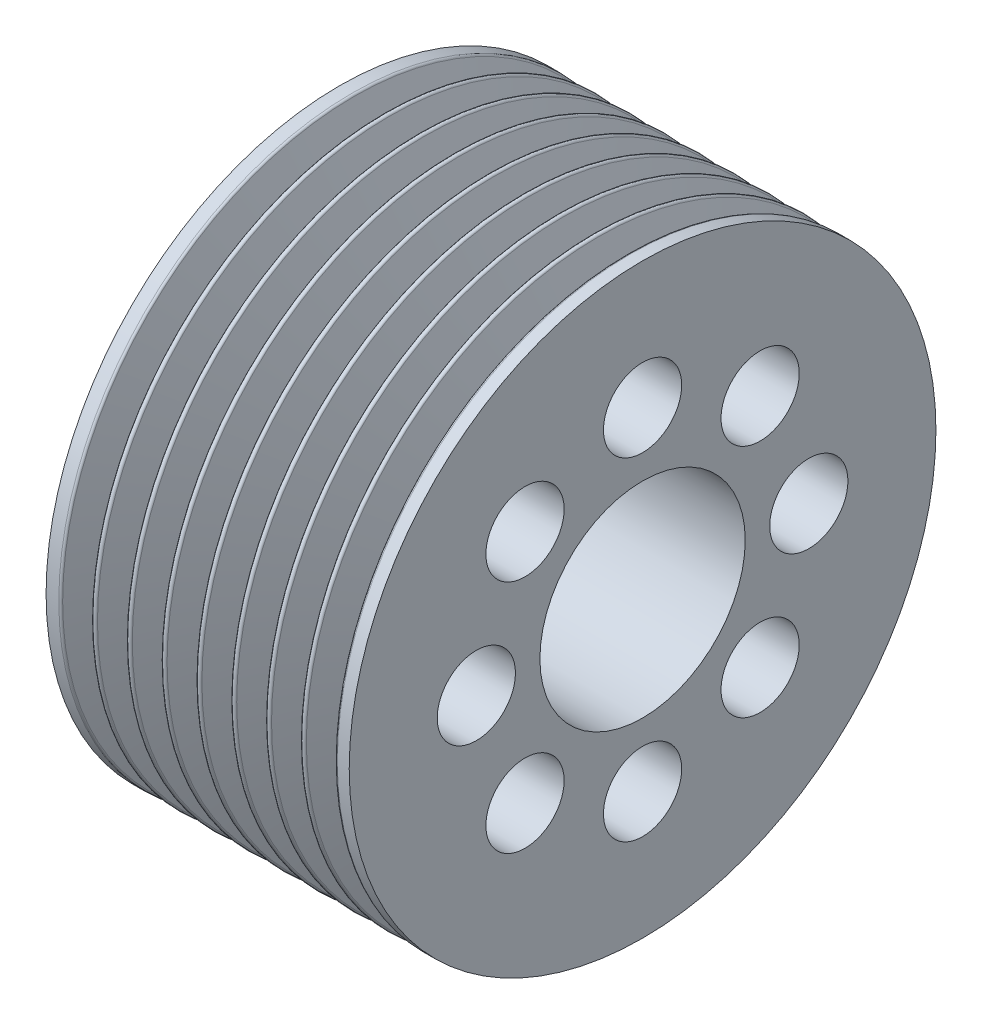
ISO-10303-21;
HEADER;
FILE_DESCRIPTION(('STEP AP214'),'2;1');
FILE_NAME('part.step','',(''),(''),'','','');
FILE_SCHEMA(('AUTOMOTIVE_DESIGN { 1 0 10303 214 1 1 1 1 }'));
ENDSEC;
DATA;
#1=APPLICATION_CONTEXT('core data for automotive mechanical design processes');
#2=APPLICATION_PROTOCOL_DEFINITION('international standard','automotive_design',2000,#1);
#3=PRODUCT_CONTEXT('',#1,'mechanical');
#4=PRODUCT('Part','Part','',(#3));
#5=PRODUCT_RELATED_PRODUCT_CATEGORY('part','',(#4));
#6=PRODUCT_DEFINITION_FORMATION('','',#4);
#7=PRODUCT_DEFINITION_CONTEXT('part definition',#1,'design');
#8=PRODUCT_DEFINITION('design','',#6,#7);
#9=PRODUCT_DEFINITION_SHAPE('','',#8);
#10=(LENGTH_UNIT() NAMED_UNIT(*) SI_UNIT(.MILLI.,.METRE.));
#11=(NAMED_UNIT(*) PLANE_ANGLE_UNIT() SI_UNIT($,.RADIAN.));
#12=(NAMED_UNIT(*) SI_UNIT($,.STERADIAN.) SOLID_ANGLE_UNIT());
#13=UNCERTAINTY_MEASURE_WITH_UNIT(LENGTH_MEASURE(1.E-05),#10,'distance_accuracy_value','');
#14=(GEOMETRIC_REPRESENTATION_CONTEXT(3) GLOBAL_UNCERTAINTY_ASSIGNED_CONTEXT((#13)) GLOBAL_UNIT_ASSIGNED_CONTEXT((#10,
#11,#12)) REPRESENTATION_CONTEXT('',''));
#15=CARTESIAN_POINT('',(0.,0.,0.));
#16=DIRECTION('',(0.,0.,1.));
#17=DIRECTION('',(1.,0.,0.));
#18=AXIS2_PLACEMENT_3D('',#15,#16,#17);
#19=CARTESIAN_POINT('',(0.,0.,0.));
#20=DIRECTION('',(-1.,0.,0.));
#21=DIRECTION('',(0.,0.,1.));
#22=AXIS2_PLACEMENT_3D('',#19,#20,#21);
#23=CYLINDRICAL_SURFACE('',#22,30.);
#24=CARTESIAN_POINT('',(18.,0.,0.));
#25=DIRECTION('',(-1.,0.,0.));
#26=DIRECTION('',(0.,0.,1.));
#27=AXIS2_PLACEMENT_3D('',#24,#25,#26);
#28=CIRCLE('',#27,30.);
#29=CARTESIAN_POINT('',(18.,0.,30.));
#30=VERTEX_POINT('',#29);
#31=EDGE_CURVE('E54',#30,#30,#28,.T.);
#32=ORIENTED_EDGE('',*,*,#31,.F.);
#33=EDGE_LOOP('',(#32));
#34=FACE_BOUND('',#33,.T.);
#35=CARTESIAN_POINT('',(19.3,0.,0.));
#36=DIRECTION('',(-1.,0.,0.));
#37=DIRECTION('',(0.,0.,1.));
#38=AXIS2_PLACEMENT_3D('',#35,#36,#37);
#39=CIRCLE('',#38,30.);
#40=CARTESIAN_POINT('',(19.3,0.,30.));
#41=VERTEX_POINT('',#40);
#42=EDGE_CURVE('E168',#41,#41,#39,.T.);
#43=ORIENTED_EDGE('',*,*,#42,.T.);
#44=EDGE_LOOP('',(#43));
#45=FACE_BOUND('',#44,.T.);
#46=ADVANCED_FACE('F42',(#34,#45),#23,.T.);
#47=CARTESIAN_POINT('',(31.5,10.5,0.));
#48=DIRECTION('',(1.,0.,0.));
#49=DIRECTION('',(0.,0.,-1.));
#50=AXIS2_PLACEMENT_3D('',#47,#48,#49);
#51=PLANE('',#50);
#52=CARTESIAN_POINT('',(31.5,12.0208152801713,12.0208152801713));
#53=DIRECTION('',(1.,0.,0.));
#54=DIRECTION('',(0.,0.,-1.));
#55=AXIS2_PLACEMENT_3D('',#52,#53,#54);
#56=CIRCLE('',#55,4.);
#57=CARTESIAN_POINT('',(31.5,12.0208152801713,8.02081528017131));
#58=VERTEX_POINT('',#57);
#59=EDGE_CURVE('E213',#58,#58,#56,.F.);
#60=ORIENTED_EDGE('',*,*,#59,.F.);
#61=EDGE_LOOP('',(#60));
#62=FACE_BOUND('',#61,.T.);
#63=CARTESIAN_POINT('',(31.5,-12.0208152801713,12.0208152801713));
#64=DIRECTION('',(1.,0.,0.));
#65=DIRECTION('',(0.,0.,-1.));
#66=AXIS2_PLACEMENT_3D('',#63,#64,#65);
#67=CIRCLE('',#66,4.);
#68=CARTESIAN_POINT('',(31.5,-12.0208152801713,8.02081528017133));
#69=VERTEX_POINT('',#68);
#70=EDGE_CURVE('E207',#69,#69,#67,.F.);
#71=ORIENTED_EDGE('',*,*,#70,.F.);
#72=EDGE_LOOP('',(#71));
#73=FACE_BOUND('',#72,.T.);
#74=CARTESIAN_POINT('',(31.5,-17.,-2.47198095326695E-13));
#75=DIRECTION('',(1.,0.,0.));
#76=DIRECTION('',(0.,0.,-1.));
#77=AXIS2_PLACEMENT_3D('',#74,#75,#76);
#78=CIRCLE('',#77,4.);
#79=CARTESIAN_POINT('',(31.5,-17.,-4.00000000000025));
#80=VERTEX_POINT('',#79);
#81=EDGE_CURVE('E201',#80,#80,#78,.F.);
#82=ORIENTED_EDGE('',*,*,#81,.F.);
#83=EDGE_LOOP('',(#82));
#84=FACE_BOUND('',#83,.T.);
#85=CARTESIAN_POINT('',(31.5,-12.020815280171,-12.0208152801716));
#86=DIRECTION('',(1.,0.,0.));
#87=DIRECTION('',(0.,0.,-1.));
#88=AXIS2_PLACEMENT_3D('',#85,#86,#87);
#89=CIRCLE('',#88,4.);
#90=CARTESIAN_POINT('',(31.5,-12.020815280171,-16.0208152801716));
#91=VERTEX_POINT('',#90);
#92=EDGE_CURVE('E195',#91,#91,#89,.F.);
#93=ORIENTED_EDGE('',*,*,#92,.F.);
#94=EDGE_LOOP('',(#93));
#95=FACE_BOUND('',#94,.T.);
#96=CARTESIAN_POINT('',(31.5,0.,-17.));
#97=DIRECTION('',(1.,0.,0.));
#98=DIRECTION('',(0.,0.,-1.));
#99=AXIS2_PLACEMENT_3D('',#96,#97,#98);
#100=CIRCLE('',#99,4.);
#101=CARTESIAN_POINT('',(31.5,0.,-21.));
#102=VERTEX_POINT('',#101);
#103=EDGE_CURVE('E189',#102,#102,#100,.F.);
#104=ORIENTED_EDGE('',*,*,#103,.F.);
#105=EDGE_LOOP('',(#104));
#106=FACE_BOUND('',#105,.T.);
#107=CARTESIAN_POINT('',(31.5,12.0208152801713,-12.0208152801713));
#108=DIRECTION('',(1.,0.,0.));
#109=DIRECTION('',(0.,0.,-1.));
#110=AXIS2_PLACEMENT_3D('',#107,#108,#109);
#111=CIRCLE('',#110,4.);
#112=CARTESIAN_POINT('',(31.5,12.0208152801713,-16.0208152801713));
#113=VERTEX_POINT('',#112);
#114=EDGE_CURVE('E183',#113,#113,#111,.F.);
#115=ORIENTED_EDGE('',*,*,#114,.F.);
#116=EDGE_LOOP('',(#115));
#117=FACE_BOUND('',#116,.T.);
#118=CARTESIAN_POINT('',(31.5,1.72382073893029E-13,17.));
#119=DIRECTION('',(1.,0.,0.));
#120=DIRECTION('',(0.,0.,-1.));
#121=AXIS2_PLACEMENT_3D('',#118,#119,#120);
#122=CIRCLE('',#121,4.);
#123=CARTESIAN_POINT('',(31.5,1.72382073893029E-13,13.));
#124=VERTEX_POINT('',#123);
#125=EDGE_CURVE('E177',#124,#124,#122,.F.);
#126=ORIENTED_EDGE('',*,*,#125,.F.);
#127=EDGE_LOOP('',(#126));
#128=FACE_BOUND('',#127,.T.);
#129=CARTESIAN_POINT('',(31.5,17.,0.));
#130=DIRECTION('',(1.,0.,0.));
#131=DIRECTION('',(0.,0.,-1.));
#132=AXIS2_PLACEMENT_3D('',#129,#130,#131);
#133=CIRCLE('',#132,4.);
#134=CARTESIAN_POINT('',(31.5,17.,-4.));
#135=VERTEX_POINT('',#134);
#136=EDGE_CURVE('E171',#135,#135,#133,.F.);
#137=ORIENTED_EDGE('',*,*,#136,.F.);
#138=EDGE_LOOP('',(#137));
#139=FACE_BOUND('',#138,.T.);
#140=CARTESIAN_POINT('',(31.5,0.,0.));
#141=DIRECTION('',(-1.,0.,0.));
#142=DIRECTION('',(0.,0.,1.));
#143=AXIS2_PLACEMENT_3D('',#140,#141,#142);
#144=CIRCLE('',#143,10.5);
#145=CARTESIAN_POINT('',(31.5,0.,10.5));
#146=VERTEX_POINT('',#145);
#147=EDGE_CURVE('E66',#146,#146,#144,.T.);
#148=ORIENTED_EDGE('',*,*,#147,.F.);
#149=EDGE_LOOP('',(#148));
#150=FACE_BOUND('',#149,.T.);
#151=CARTESIAN_POINT('',(31.5,0.,0.));
#152=DIRECTION('',(-1.,0.,0.));
#153=DIRECTION('',(0.,0.,1.));
#154=AXIS2_PLACEMENT_3D('',#151,#152,#153);
#155=CIRCLE('',#154,21.5);
#156=CARTESIAN_POINT('',(31.5,0.,21.5));
#157=VERTEX_POINT('',#156);
#158=EDGE_CURVE('E10',#157,#157,#155,.T.);
#159=ORIENTED_EDGE('',*,*,#158,.T.);
#160=EDGE_LOOP('',(#159));
#161=FACE_BOUND('',#160,.T.);
#162=ADVANCED_FACE('F45',(#62,#73,#84,#95,#106,#117,#128,#139,#150,#161),#51,.F.);
#163=CARTESIAN_POINT('',(0.,0.,0.));
#164=DIRECTION('',(-1.,0.,0.));
#165=DIRECTION('',(0.,0.,1.));
#166=AXIS2_PLACEMENT_3D('',#163,#164,#165);
#167=CYLINDRICAL_SURFACE('',#166,21.5);
#168=ORIENTED_EDGE('',*,*,#158,.F.);
#169=EDGE_LOOP('',(#168));
#170=FACE_BOUND('',#169,.T.);
#171=CARTESIAN_POINT('',(18.,0.,0.));
#172=DIRECTION('',(-1.,0.,0.));
#173=DIRECTION('',(0.,0.,1.));
#174=AXIS2_PLACEMENT_3D('',#171,#172,#173);
#175=CIRCLE('',#174,21.5);
#176=CARTESIAN_POINT('',(18.,0.,21.5));
#177=VERTEX_POINT('',#176);
#178=EDGE_CURVE('E50',#177,#177,#175,.T.);
#179=ORIENTED_EDGE('',*,*,#178,.T.);
#180=EDGE_LOOP('',(#179));
#181=FACE_BOUND('',#180,.T.);
#182=ADVANCED_FACE('F253',(#170,#181),#167,.F.);
#183=CARTESIAN_POINT('',(18.,30.,0.));
#184=DIRECTION('',(1.,0.,0.));
#185=DIRECTION('',(0.,0.,-1.));
#186=AXIS2_PLACEMENT_3D('',#183,#184,#185);
#187=PLANE('',#186);
#188=ORIENTED_EDGE('',*,*,#178,.F.);
#189=EDGE_LOOP('',(#188));
#190=FACE_BOUND('',#189,.T.);
#191=ORIENTED_EDGE('',*,*,#31,.T.);
#192=EDGE_LOOP('',(#191));
#193=FACE_BOUND('',#192,.T.);
#194=ADVANCED_FACE('F259',(#190,#193),#187,.F.);
#195=CARTESIAN_POINT('',(47.78,0.,0.));
#196=DIRECTION('',(-1.,0.,0.));
#197=DIRECTION('',(0.,0.,1.));
#198=AXIS2_PLACEMENT_3D('',#195,#196,#197);
#199=CIRCLE('',#198,30.);
#200=CARTESIAN_POINT('',(47.78,0.,30.));
#201=VERTEX_POINT('',#200);
#202=EDGE_CURVE('E81',#201,#201,#199,.T.);
#203=ORIENTED_EDGE('',*,*,#202,.F.);
#204=EDGE_LOOP('',(#203));
#205=FACE_BOUND('',#204,.T.);
#206=CARTESIAN_POINT('',(49.,0.,0.));
#207=DIRECTION('',(-1.,0.,0.));
#208=DIRECTION('',(0.,0.,1.));
#209=AXIS2_PLACEMENT_3D('',#206,#207,#208);
#210=CIRCLE('',#209,30.);
#211=CARTESIAN_POINT('',(49.,0.,30.));
#212=VERTEX_POINT('',#211);
#213=EDGE_CURVE('E58',#212,#212,#210,.T.);
#214=ORIENTED_EDGE('',*,*,#213,.T.);
#215=EDGE_LOOP('',(#214));
#216=FACE_BOUND('',#215,.T.);
#217=ADVANCED_FACE('F226',(#205,#216),#23,.T.);
#218=CARTESIAN_POINT('',(49.,10.5,0.));
#219=DIRECTION('',(-1.,0.,0.));
#220=DIRECTION('',(0.,0.,1.));
#221=AXIS2_PLACEMENT_3D('',#218,#219,#220);
#222=PLANE('',#221);
#223=CARTESIAN_POINT('',(49.,12.0208152801713,12.0208152801713));
#224=DIRECTION('',(1.,0.,0.));
#225=DIRECTION('',(0.,0.,-1.));
#226=AXIS2_PLACEMENT_3D('',#223,#224,#225);
#227=CIRCLE('',#226,4.);
#228=CARTESIAN_POINT('',(49.,12.0208152801713,8.02081528017131));
#229=VERTEX_POINT('',#228);
#230=EDGE_CURVE('E216',#229,#229,#227,.T.);
#231=ORIENTED_EDGE('',*,*,#230,.F.);
#232=EDGE_LOOP('',(#231));
#233=FACE_BOUND('',#232,.T.);
#234=CARTESIAN_POINT('',(49.,-12.0208152801713,12.0208152801713));
#235=DIRECTION('',(1.,0.,0.));
#236=DIRECTION('',(0.,0.,-1.));
#237=AXIS2_PLACEMENT_3D('',#234,#235,#236);
#238=CIRCLE('',#237,4.);
#239=CARTESIAN_POINT('',(49.,-12.0208152801713,8.02081528017133));
#240=VERTEX_POINT('',#239);
#241=EDGE_CURVE('E210',#240,#240,#238,.T.);
#242=ORIENTED_EDGE('',*,*,#241,.F.);
#243=EDGE_LOOP('',(#242));
#244=FACE_BOUND('',#243,.T.);
#245=CARTESIAN_POINT('',(49.,-17.,-2.47198095326695E-13));
#246=DIRECTION('',(1.,0.,0.));
#247=DIRECTION('',(0.,0.,-1.));
#248=AXIS2_PLACEMENT_3D('',#245,#246,#247);
#249=CIRCLE('',#248,4.);
#250=CARTESIAN_POINT('',(49.,-17.,-4.00000000000025));
#251=VERTEX_POINT('',#250);
#252=EDGE_CURVE('E204',#251,#251,#249,.T.);
#253=ORIENTED_EDGE('',*,*,#252,.F.);
#254=EDGE_LOOP('',(#253));
#255=FACE_BOUND('',#254,.T.);
#256=CARTESIAN_POINT('',(49.,-12.020815280171,-12.0208152801716));
#257=DIRECTION('',(1.,0.,0.));
#258=DIRECTION('',(0.,0.,-1.));
#259=AXIS2_PLACEMENT_3D('',#256,#257,#258);
#260=CIRCLE('',#259,4.);
#261=CARTESIAN_POINT('',(49.,-12.020815280171,-16.0208152801716));
#262=VERTEX_POINT('',#261);
#263=EDGE_CURVE('E198',#262,#262,#260,.T.);
#264=ORIENTED_EDGE('',*,*,#263,.F.);
#265=EDGE_LOOP('',(#264));
#266=FACE_BOUND('',#265,.T.);
#267=CARTESIAN_POINT('',(49.,0.,-17.));
#268=DIRECTION('',(1.,0.,0.));
#269=DIRECTION('',(0.,0.,-1.));
#270=AXIS2_PLACEMENT_3D('',#267,#268,#269);
#271=CIRCLE('',#270,4.);
#272=CARTESIAN_POINT('',(49.,0.,-21.));
#273=VERTEX_POINT('',#272);
#274=EDGE_CURVE('E192',#273,#273,#271,.T.);
#275=ORIENTED_EDGE('',*,*,#274,.F.);
#276=EDGE_LOOP('',(#275));
#277=FACE_BOUND('',#276,.T.);
#278=CARTESIAN_POINT('',(49.,12.0208152801713,-12.0208152801713));
#279=DIRECTION('',(1.,0.,0.));
#280=DIRECTION('',(0.,0.,-1.));
#281=AXIS2_PLACEMENT_3D('',#278,#279,#280);
#282=CIRCLE('',#281,4.);
#283=CARTESIAN_POINT('',(49.,12.0208152801713,-16.0208152801713));
#284=VERTEX_POINT('',#283);
#285=EDGE_CURVE('E186',#284,#284,#282,.T.);
#286=ORIENTED_EDGE('',*,*,#285,.F.);
#287=EDGE_LOOP('',(#286));
#288=FACE_BOUND('',#287,.T.);
#289=CARTESIAN_POINT('',(49.,1.72382073893029E-13,17.));
#290=DIRECTION('',(1.,0.,0.));
#291=DIRECTION('',(0.,0.,-1.));
#292=AXIS2_PLACEMENT_3D('',#289,#290,#291);
#293=CIRCLE('',#292,4.);
#294=CARTESIAN_POINT('',(49.,1.72382073893029E-13,13.));
#295=VERTEX_POINT('',#294);
#296=EDGE_CURVE('E180',#295,#295,#293,.T.);
#297=ORIENTED_EDGE('',*,*,#296,.F.);
#298=EDGE_LOOP('',(#297));
#299=FACE_BOUND('',#298,.T.);
#300=CARTESIAN_POINT('',(49.,17.,0.));
#301=DIRECTION('',(1.,0.,0.));
#302=DIRECTION('',(0.,0.,-1.));
#303=AXIS2_PLACEMENT_3D('',#300,#301,#302);
#304=CIRCLE('',#303,4.);
#305=CARTESIAN_POINT('',(49.,17.,-4.));
#306=VERTEX_POINT('',#305);
#307=EDGE_CURVE('E174',#306,#306,#304,.T.);
#308=ORIENTED_EDGE('',*,*,#307,.F.);
#309=EDGE_LOOP('',(#308));
#310=FACE_BOUND('',#309,.T.);
#311=ORIENTED_EDGE('',*,*,#213,.F.);
#312=EDGE_LOOP('',(#311));
#313=FACE_BOUND('',#312,.T.);
#314=CARTESIAN_POINT('',(49.,0.,0.));
#315=DIRECTION('',(-1.,0.,0.));
#316=DIRECTION('',(0.,0.,1.));
#317=AXIS2_PLACEMENT_3D('',#314,#315,#316);
#318=CIRCLE('',#317,10.5);
#319=CARTESIAN_POINT('',(49.,0.,10.5));
#320=VERTEX_POINT('',#319);
#321=EDGE_CURVE('E63',#320,#320,#318,.T.);
#322=ORIENTED_EDGE('',*,*,#321,.T.);
#323=EDGE_LOOP('',(#322));
#324=FACE_BOUND('',#323,.T.);
#325=ADVANCED_FACE('F222',(#233,#244,#255,#266,#277,#288,#299,#310,#313,#324),#222,.F.);
#326=CARTESIAN_POINT('',(0.,0.,0.));
#327=DIRECTION('',(-1.,0.,0.));
#328=DIRECTION('',(0.,0.,1.));
#329=AXIS2_PLACEMENT_3D('',#326,#327,#328);
#330=CYLINDRICAL_SURFACE('',#329,10.5);
#331=ORIENTED_EDGE('',*,*,#321,.F.);
#332=EDGE_LOOP('',(#331));
#333=FACE_BOUND('',#332,.T.);
#334=ORIENTED_EDGE('',*,*,#147,.T.);
#335=EDGE_LOOP('',(#334));
#336=FACE_BOUND('',#335,.T.);
#337=ADVANCED_FACE('F225',(#333,#336),#330,.F.);
#338=CARTESIAN_POINT('',(47.78,0.,0.));
#339=DIRECTION('',(-1.,0.,0.));
#340=DIRECTION('',(0.,0.,1.));
#341=AXIS2_PLACEMENT_3D('',#338,#339,#340);
#342=TOROIDAL_SURFACE('',#341,29.75,0.249999999999997);
#343=ORIENTED_EDGE('',*,*,#202,.T.);
#344=EDGE_LOOP('',(#343));
#345=FACE_BOUND('',#344,.T.);
#346=CARTESIAN_POINT('',(47.5458319526879,0.,0.));
#347=DIRECTION('',(-1.,0.,0.));
#348=DIRECTION('',(0.,0.,1.));
#349=AXIS2_PLACEMENT_3D('',#346,#347,#348);
#350=CIRCLE('',#349,29.8375518453149);
#351=CARTESIAN_POINT('',(47.5458319526879,0.,29.8375518453149));
#352=VERTEX_POINT('',#351);
#353=EDGE_CURVE('E69',#352,#352,#350,.T.);
#354=ORIENTED_EDGE('',*,*,#353,.F.);
#355=EDGE_LOOP('',(#354));
#356=FACE_BOUND('',#355,.T.);
#357=ADVANCED_FACE('F248',(#345,#356),#342,.T.);
#358=CARTESIAN_POINT('',(46.2810016567745,0.,0.));
#359=DIRECTION('',(1.,0.,0.));
#360=DIRECTION('',(0.,0.,-1.));
#361=AXIS2_PLACEMENT_3D('',#358,#359,#360);
#362=CONICAL_SURFACE('',#361,26.4546095496951,1.21300383013606);
#363=ORIENTED_EDGE('',*,*,#353,.T.);
#364=EDGE_LOOP('',(#363));
#365=FACE_BOUND('',#364,.T.);
#366=CARTESIAN_POINT('',(46.2810016567745,0.,0.));
#367=DIRECTION('',(-1.,0.,0.));
#368=DIRECTION('',(0.,0.,1.));
#369=AXIS2_PLACEMENT_3D('',#366,#367,#368);
#370=CIRCLE('',#369,26.4546095496951);
#371=CARTESIAN_POINT('',(46.2810016567745,0.,26.4546095496951));
#372=VERTEX_POINT('',#371);
#373=EDGE_CURVE('E72',#372,#372,#370,.T.);
#374=ORIENTED_EDGE('',*,*,#373,.F.);
#375=EDGE_LOOP('',(#374));
#376=FACE_BOUND('',#375,.T.);
#377=ADVANCED_FACE('F449',(#365,#376),#362,.T.);
#378=CARTESIAN_POINT('',(46.,0.,0.));
#379=DIRECTION('',(-1.,0.,0.));
#380=DIRECTION('',(0.,0.,1.));
#381=AXIS2_PLACEMENT_3D('',#378,#379,#380);
#382=TOROIDAL_SURFACE('',#381,26.5596717640729,0.300000000000001);
#383=ORIENTED_EDGE('',*,*,#373,.T.);
#384=EDGE_LOOP('',(#383));
#385=FACE_BOUND('',#384,.T.);
#386=CARTESIAN_POINT('',(45.7189983432255,0.,0.));
#387=DIRECTION('',(-1.,0.,0.));
#388=DIRECTION('',(0.,0.,1.));
#389=AXIS2_PLACEMENT_3D('',#386,#387,#388);
#390=CIRCLE('',#389,26.4546095496951);
#391=CARTESIAN_POINT('',(45.7189983432255,0.,26.4546095496951));
#392=VERTEX_POINT('',#391);
#393=EDGE_CURVE('E75',#392,#392,#390,.T.);
#394=ORIENTED_EDGE('',*,*,#393,.F.);
#395=EDGE_LOOP('',(#394));
#396=FACE_BOUND('',#395,.T.);
#397=ADVANCED_FACE('F444',(#385,#396),#382,.F.);
#398=CARTESIAN_POINT('',(44.4541680473121,0.,0.));
#399=DIRECTION('',(-1.,0.,0.));
#400=DIRECTION('',(0.,0.,1.));
#401=AXIS2_PLACEMENT_3D('',#398,#399,#400);
#402=CONICAL_SURFACE('',#401,29.8375518453149,1.21300383013606);
#403=ORIENTED_EDGE('',*,*,#393,.T.);
#404=EDGE_LOOP('',(#403));
#405=FACE_BOUND('',#404,.T.);
#406=CARTESIAN_POINT('',(44.4541680473121,0.,0.));
#407=DIRECTION('',(-1.,0.,0.));
#408=DIRECTION('',(0.,0.,1.));
#409=AXIS2_PLACEMENT_3D('',#406,#407,#408);
#410=CIRCLE('',#409,29.8375518453149);
#411=CARTESIAN_POINT('',(44.4541680473121,0.,29.8375518453149));
#412=VERTEX_POINT('',#411);
#413=EDGE_CURVE('E78',#412,#412,#410,.T.);
#414=ORIENTED_EDGE('',*,*,#413,.F.);
#415=EDGE_LOOP('',(#414));
#416=FACE_BOUND('',#415,.T.);
#417=ADVANCED_FACE('F439',(#405,#416),#402,.T.);
#418=CARTESIAN_POINT('',(44.22,0.,0.));
#419=DIRECTION('',(-1.,0.,0.));
#420=DIRECTION('',(0.,0.,1.));
#421=AXIS2_PLACEMENT_3D('',#418,#419,#420);
#422=TOROIDAL_SURFACE('',#421,29.75,0.250000000000004);
#423=ORIENTED_EDGE('',*,*,#413,.T.);
#424=EDGE_LOOP('',(#423));
#425=FACE_BOUND('',#424,.T.);
#426=CARTESIAN_POINT('',(43.9858319526879,0.,0.));
#427=DIRECTION('',(-1.,0.,0.));
#428=DIRECTION('',(0.,0.,1.));
#429=AXIS2_PLACEMENT_3D('',#426,#427,#428);
#430=CIRCLE('',#429,29.8375518453149);
#431=CARTESIAN_POINT('',(43.9858319526879,0.,29.8375518453149));
#432=VERTEX_POINT('',#431);
#433=EDGE_CURVE('E84',#432,#432,#430,.T.);
#434=ORIENTED_EDGE('',*,*,#433,.F.);
#435=EDGE_LOOP('',(#434));
#436=FACE_BOUND('',#435,.T.);
#437=ADVANCED_FACE('F434',(#425,#436),#422,.T.);
#438=CARTESIAN_POINT('',(42.7210016567745,0.,0.));
#439=DIRECTION('',(1.,0.,0.));
#440=DIRECTION('',(0.,0.,-1.));
#441=AXIS2_PLACEMENT_3D('',#438,#439,#440);
#442=CONICAL_SURFACE('',#441,26.4546095496951,1.21300383013606);
#443=ORIENTED_EDGE('',*,*,#433,.T.);
#444=EDGE_LOOP('',(#443));
#445=FACE_BOUND('',#444,.T.);
#446=CARTESIAN_POINT('',(42.7210016567745,0.,0.));
#447=DIRECTION('',(-1.,0.,0.));
#448=DIRECTION('',(0.,0.,1.));
#449=AXIS2_PLACEMENT_3D('',#446,#447,#448);
#450=CIRCLE('',#449,26.4546095496951);
#451=CARTESIAN_POINT('',(42.7210016567745,0.,26.4546095496951));
#452=VERTEX_POINT('',#451);
#453=EDGE_CURVE('E87',#452,#452,#450,.T.);
#454=ORIENTED_EDGE('',*,*,#453,.F.);
#455=EDGE_LOOP('',(#454));
#456=FACE_BOUND('',#455,.T.);
#457=ADVANCED_FACE('F429',(#445,#456),#442,.T.);
#458=CARTESIAN_POINT('',(42.44,0.,0.));
#459=DIRECTION('',(-1.,0.,0.));
#460=DIRECTION('',(0.,0.,1.));
#461=AXIS2_PLACEMENT_3D('',#458,#459,#460);
#462=TOROIDAL_SURFACE('',#461,26.5596717640729,0.300000000000001);
#463=ORIENTED_EDGE('',*,*,#453,.T.);
#464=EDGE_LOOP('',(#463));
#465=FACE_BOUND('',#464,.T.);
#466=CARTESIAN_POINT('',(42.1589983432255,0.,0.));
#467=DIRECTION('',(-1.,0.,0.));
#468=DIRECTION('',(0.,0.,1.));
#469=AXIS2_PLACEMENT_3D('',#466,#467,#468);
#470=CIRCLE('',#469,26.4546095496951);
#471=CARTESIAN_POINT('',(42.1589983432255,0.,26.4546095496951));
#472=VERTEX_POINT('',#471);
#473=EDGE_CURVE('E90',#472,#472,#470,.T.);
#474=ORIENTED_EDGE('',*,*,#473,.F.);
#475=EDGE_LOOP('',(#474));
#476=FACE_BOUND('',#475,.T.);
#477=ADVANCED_FACE('F424',(#465,#476),#462,.F.);
#478=CARTESIAN_POINT('',(40.8941680473121,0.,0.));
#479=DIRECTION('',(-1.,0.,0.));
#480=DIRECTION('',(0.,0.,1.));
#481=AXIS2_PLACEMENT_3D('',#478,#479,#480);
#482=CONICAL_SURFACE('',#481,29.8375518453149,1.21300383013606);
#483=ORIENTED_EDGE('',*,*,#473,.T.);
#484=EDGE_LOOP('',(#483));
#485=FACE_BOUND('',#484,.T.);
#486=CARTESIAN_POINT('',(40.8941680473121,0.,0.));
#487=DIRECTION('',(-1.,0.,0.));
#488=DIRECTION('',(0.,0.,1.));
#489=AXIS2_PLACEMENT_3D('',#486,#487,#488);
#490=CIRCLE('',#489,29.8375518453149);
#491=CARTESIAN_POINT('',(40.8941680473121,0.,29.8375518453149));
#492=VERTEX_POINT('',#491);
#493=EDGE_CURVE('E93',#492,#492,#490,.T.);
#494=ORIENTED_EDGE('',*,*,#493,.F.);
#495=EDGE_LOOP('',(#494));
#496=FACE_BOUND('',#495,.T.);
#497=ADVANCED_FACE('F419',(#485,#496),#482,.T.);
#498=CARTESIAN_POINT('',(40.66,0.,0.));
#499=DIRECTION('',(-1.,0.,0.));
#500=DIRECTION('',(0.,0.,1.));
#501=AXIS2_PLACEMENT_3D('',#498,#499,#500);
#502=TOROIDAL_SURFACE('',#501,29.75,0.250000000000004);
#503=ORIENTED_EDGE('',*,*,#493,.T.);
#504=EDGE_LOOP('',(#503));
#505=FACE_BOUND('',#504,.T.);
#506=CARTESIAN_POINT('',(40.4258319526879,0.,0.));
#507=DIRECTION('',(-1.,0.,0.));
#508=DIRECTION('',(0.,0.,1.));
#509=AXIS2_PLACEMENT_3D('',#506,#507,#508);
#510=CIRCLE('',#509,29.8375518453149);
#511=CARTESIAN_POINT('',(40.4258319526879,0.,29.8375518453149));
#512=VERTEX_POINT('',#511);
#513=EDGE_CURVE('E96',#512,#512,#510,.T.);
#514=ORIENTED_EDGE('',*,*,#513,.F.);
#515=EDGE_LOOP('',(#514));
#516=FACE_BOUND('',#515,.T.);
#517=ADVANCED_FACE('F414',(#505,#516),#502,.T.);
#518=CARTESIAN_POINT('',(39.1610016567745,0.,0.));
#519=DIRECTION('',(1.,0.,0.));
#520=DIRECTION('',(0.,0.,-1.));
#521=AXIS2_PLACEMENT_3D('',#518,#519,#520);
#522=CONICAL_SURFACE('',#521,26.4546095496951,1.21300383013606);
#523=ORIENTED_EDGE('',*,*,#513,.T.);
#524=EDGE_LOOP('',(#523));
#525=FACE_BOUND('',#524,.T.);
#526=CARTESIAN_POINT('',(39.1610016567745,0.,0.));
#527=DIRECTION('',(-1.,0.,0.));
#528=DIRECTION('',(0.,0.,1.));
#529=AXIS2_PLACEMENT_3D('',#526,#527,#528);
#530=CIRCLE('',#529,26.4546095496951);
#531=CARTESIAN_POINT('',(39.1610016567745,0.,26.4546095496951));
#532=VERTEX_POINT('',#531);
#533=EDGE_CURVE('E99',#532,#532,#530,.T.);
#534=ORIENTED_EDGE('',*,*,#533,.F.);
#535=EDGE_LOOP('',(#534));
#536=FACE_BOUND('',#535,.T.);
#537=ADVANCED_FACE('F409',(#525,#536),#522,.T.);
#538=CARTESIAN_POINT('',(38.88,0.,0.));
#539=DIRECTION('',(-1.,0.,0.));
#540=DIRECTION('',(0.,0.,1.));
#541=AXIS2_PLACEMENT_3D('',#538,#539,#540);
#542=TOROIDAL_SURFACE('',#541,26.5596717640729,0.300000000000001);
#543=ORIENTED_EDGE('',*,*,#533,.T.);
#544=EDGE_LOOP('',(#543));
#545=FACE_BOUND('',#544,.T.);
#546=CARTESIAN_POINT('',(38.5989983432255,0.,0.));
#547=DIRECTION('',(-1.,0.,0.));
#548=DIRECTION('',(0.,0.,1.));
#549=AXIS2_PLACEMENT_3D('',#546,#547,#548);
#550=CIRCLE('',#549,26.4546095496951);
#551=CARTESIAN_POINT('',(38.5989983432255,0.,26.4546095496951));
#552=VERTEX_POINT('',#551);
#553=EDGE_CURVE('E102',#552,#552,#550,.T.);
#554=ORIENTED_EDGE('',*,*,#553,.F.);
#555=EDGE_LOOP('',(#554));
#556=FACE_BOUND('',#555,.T.);
#557=ADVANCED_FACE('F404',(#545,#556),#542,.F.);
#558=CARTESIAN_POINT('',(37.3341680473121,0.,0.));
#559=DIRECTION('',(-1.,0.,0.));
#560=DIRECTION('',(0.,0.,1.));
#561=AXIS2_PLACEMENT_3D('',#558,#559,#560);
#562=CONICAL_SURFACE('',#561,29.8375518453149,1.21300383013606);
#563=ORIENTED_EDGE('',*,*,#553,.T.);
#564=EDGE_LOOP('',(#563));
#565=FACE_BOUND('',#564,.T.);
#566=CARTESIAN_POINT('',(37.3341680473121,0.,0.));
#567=DIRECTION('',(-1.,0.,0.));
#568=DIRECTION('',(0.,0.,1.));
#569=AXIS2_PLACEMENT_3D('',#566,#567,#568);
#570=CIRCLE('',#569,29.8375518453149);
#571=CARTESIAN_POINT('',(37.3341680473121,0.,29.8375518453149));
#572=VERTEX_POINT('',#571);
#573=EDGE_CURVE('E105',#572,#572,#570,.T.);
#574=ORIENTED_EDGE('',*,*,#573,.F.);
#575=EDGE_LOOP('',(#574));
#576=FACE_BOUND('',#575,.T.);
#577=ADVANCED_FACE('F399',(#565,#576),#562,.T.);
#578=CARTESIAN_POINT('',(37.1,0.,0.));
#579=DIRECTION('',(-1.,0.,0.));
#580=DIRECTION('',(0.,0.,1.));
#581=AXIS2_PLACEMENT_3D('',#578,#579,#580);
#582=TOROIDAL_SURFACE('',#581,29.75,0.250000000000004);
#583=ORIENTED_EDGE('',*,*,#573,.T.);
#584=EDGE_LOOP('',(#583));
#585=FACE_BOUND('',#584,.T.);
#586=CARTESIAN_POINT('',(36.8658319526879,0.,0.));
#587=DIRECTION('',(-1.,0.,0.));
#588=DIRECTION('',(0.,0.,1.));
#589=AXIS2_PLACEMENT_3D('',#586,#587,#588);
#590=CIRCLE('',#589,29.8375518453149);
#591=CARTESIAN_POINT('',(36.8658319526879,0.,29.8375518453149));
#592=VERTEX_POINT('',#591);
#593=EDGE_CURVE('E108',#592,#592,#590,.T.);
#594=ORIENTED_EDGE('',*,*,#593,.F.);
#595=EDGE_LOOP('',(#594));
#596=FACE_BOUND('',#595,.T.);
#597=ADVANCED_FACE('F394',(#585,#596),#582,.T.);
#598=CARTESIAN_POINT('',(35.6010016567745,0.,0.));
#599=DIRECTION('',(1.,0.,0.));
#600=DIRECTION('',(0.,0.,-1.));
#601=AXIS2_PLACEMENT_3D('',#598,#599,#600);
#602=CONICAL_SURFACE('',#601,26.4546095496951,1.21300383013606);
#603=ORIENTED_EDGE('',*,*,#593,.T.);
#604=EDGE_LOOP('',(#603));
#605=FACE_BOUND('',#604,.T.);
#606=CARTESIAN_POINT('',(35.6010016567745,0.,0.));
#607=DIRECTION('',(-1.,0.,0.));
#608=DIRECTION('',(0.,0.,1.));
#609=AXIS2_PLACEMENT_3D('',#606,#607,#608);
#610=CIRCLE('',#609,26.4546095496951);
#611=CARTESIAN_POINT('',(35.6010016567745,0.,26.4546095496951));
#612=VERTEX_POINT('',#611);
#613=EDGE_CURVE('E111',#612,#612,#610,.T.);
#614=ORIENTED_EDGE('',*,*,#613,.F.);
#615=EDGE_LOOP('',(#614));
#616=FACE_BOUND('',#615,.T.);
#617=ADVANCED_FACE('F389',(#605,#616),#602,.T.);
#618=CARTESIAN_POINT('',(35.32,0.,0.));
#619=DIRECTION('',(-1.,0.,0.));
#620=DIRECTION('',(0.,0.,1.));
#621=AXIS2_PLACEMENT_3D('',#618,#619,#620);
#622=TOROIDAL_SURFACE('',#621,26.5596717640729,0.300000000000001);
#623=ORIENTED_EDGE('',*,*,#613,.T.);
#624=EDGE_LOOP('',(#623));
#625=FACE_BOUND('',#624,.T.);
#626=CARTESIAN_POINT('',(35.0389983432255,0.,0.));
#627=DIRECTION('',(-1.,0.,0.));
#628=DIRECTION('',(0.,0.,1.));
#629=AXIS2_PLACEMENT_3D('',#626,#627,#628);
#630=CIRCLE('',#629,26.4546095496951);
#631=CARTESIAN_POINT('',(35.0389983432255,0.,26.4546095496951));
#632=VERTEX_POINT('',#631);
#633=EDGE_CURVE('E114',#632,#632,#630,.T.);
#634=ORIENTED_EDGE('',*,*,#633,.F.);
#635=EDGE_LOOP('',(#634));
#636=FACE_BOUND('',#635,.T.);
#637=ADVANCED_FACE('F384',(#625,#636),#622,.F.);
#638=CARTESIAN_POINT('',(33.7741680473121,0.,0.));
#639=DIRECTION('',(-1.,0.,0.));
#640=DIRECTION('',(0.,0.,1.));
#641=AXIS2_PLACEMENT_3D('',#638,#639,#640);
#642=CONICAL_SURFACE('',#641,29.8375518453149,1.21300383013606);
#643=ORIENTED_EDGE('',*,*,#633,.T.);
#644=EDGE_LOOP('',(#643));
#645=FACE_BOUND('',#644,.T.);
#646=CARTESIAN_POINT('',(33.7741680473121,0.,0.));
#647=DIRECTION('',(-1.,0.,0.));
#648=DIRECTION('',(0.,0.,1.));
#649=AXIS2_PLACEMENT_3D('',#646,#647,#648);
#650=CIRCLE('',#649,29.8375518453149);
#651=CARTESIAN_POINT('',(33.7741680473121,0.,29.8375518453149));
#652=VERTEX_POINT('',#651);
#653=EDGE_CURVE('E117',#652,#652,#650,.T.);
#654=ORIENTED_EDGE('',*,*,#653,.F.);
#655=EDGE_LOOP('',(#654));
#656=FACE_BOUND('',#655,.T.);
#657=ADVANCED_FACE('F379',(#645,#656),#642,.T.);
#658=CARTESIAN_POINT('',(33.54,0.,0.));
#659=DIRECTION('',(-1.,0.,0.));
#660=DIRECTION('',(0.,0.,1.));
#661=AXIS2_PLACEMENT_3D('',#658,#659,#660);
#662=TOROIDAL_SURFACE('',#661,29.75,0.250000000000004);
#663=ORIENTED_EDGE('',*,*,#653,.T.);
#664=EDGE_LOOP('',(#663));
#665=FACE_BOUND('',#664,.T.);
#666=CARTESIAN_POINT('',(33.3058319526879,0.,0.));
#667=DIRECTION('',(-1.,0.,0.));
#668=DIRECTION('',(0.,0.,1.));
#669=AXIS2_PLACEMENT_3D('',#666,#667,#668);
#670=CIRCLE('',#669,29.8375518453149);
#671=CARTESIAN_POINT('',(33.3058319526879,0.,29.8375518453149));
#672=VERTEX_POINT('',#671);
#673=EDGE_CURVE('E120',#672,#672,#670,.T.);
#674=ORIENTED_EDGE('',*,*,#673,.F.);
#675=EDGE_LOOP('',(#674));
#676=FACE_BOUND('',#675,.T.);
#677=ADVANCED_FACE('F374',(#665,#676),#662,.T.);
#678=CARTESIAN_POINT('',(32.0410016567745,0.,0.));
#679=DIRECTION('',(1.,0.,0.));
#680=DIRECTION('',(0.,0.,-1.));
#681=AXIS2_PLACEMENT_3D('',#678,#679,#680);
#682=CONICAL_SURFACE('',#681,26.4546095496951,1.21300383013606);
#683=ORIENTED_EDGE('',*,*,#673,.T.);
#684=EDGE_LOOP('',(#683));
#685=FACE_BOUND('',#684,.T.);
#686=CARTESIAN_POINT('',(32.0410016567745,0.,0.));
#687=DIRECTION('',(-1.,0.,0.));
#688=DIRECTION('',(0.,0.,1.));
#689=AXIS2_PLACEMENT_3D('',#686,#687,#688);
#690=CIRCLE('',#689,26.4546095496951);
#691=CARTESIAN_POINT('',(32.0410016567745,0.,26.4546095496951));
#692=VERTEX_POINT('',#691);
#693=EDGE_CURVE('E123',#692,#692,#690,.T.);
#694=ORIENTED_EDGE('',*,*,#693,.F.);
#695=EDGE_LOOP('',(#694));
#696=FACE_BOUND('',#695,.T.);
#697=ADVANCED_FACE('F369',(#685,#696),#682,.T.);
#698=CARTESIAN_POINT('',(31.76,0.,0.));
#699=DIRECTION('',(-1.,0.,0.));
#700=DIRECTION('',(0.,0.,1.));
#701=AXIS2_PLACEMENT_3D('',#698,#699,#700);
#702=TOROIDAL_SURFACE('',#701,26.5596717640729,0.300000000000001);
#703=ORIENTED_EDGE('',*,*,#693,.T.);
#704=EDGE_LOOP('',(#703));
#705=FACE_BOUND('',#704,.T.);
#706=CARTESIAN_POINT('',(31.4789983432255,0.,0.));
#707=DIRECTION('',(-1.,0.,0.));
#708=DIRECTION('',(0.,0.,1.));
#709=AXIS2_PLACEMENT_3D('',#706,#707,#708);
#710=CIRCLE('',#709,26.4546095496951);
#711=CARTESIAN_POINT('',(31.4789983432255,0.,26.4546095496951));
#712=VERTEX_POINT('',#711);
#713=EDGE_CURVE('E126',#712,#712,#710,.T.);
#714=ORIENTED_EDGE('',*,*,#713,.F.);
#715=EDGE_LOOP('',(#714));
#716=FACE_BOUND('',#715,.T.);
#717=ADVANCED_FACE('F364',(#705,#716),#702,.F.);
#718=CARTESIAN_POINT('',(30.2141680473121,0.,0.));
#719=DIRECTION('',(-1.,0.,0.));
#720=DIRECTION('',(0.,0.,1.));
#721=AXIS2_PLACEMENT_3D('',#718,#719,#720);
#722=CONICAL_SURFACE('',#721,29.8375518453149,1.21300383013606);
#723=ORIENTED_EDGE('',*,*,#713,.T.);
#724=EDGE_LOOP('',(#723));
#725=FACE_BOUND('',#724,.T.);
#726=CARTESIAN_POINT('',(30.2141680473121,0.,0.));
#727=DIRECTION('',(-1.,0.,0.));
#728=DIRECTION('',(0.,0.,1.));
#729=AXIS2_PLACEMENT_3D('',#726,#727,#728);
#730=CIRCLE('',#729,29.8375518453149);
#731=CARTESIAN_POINT('',(30.2141680473121,0.,29.8375518453149));
#732=VERTEX_POINT('',#731);
#733=EDGE_CURVE('E129',#732,#732,#730,.T.);
#734=ORIENTED_EDGE('',*,*,#733,.F.);
#735=EDGE_LOOP('',(#734));
#736=FACE_BOUND('',#735,.T.);
#737=ADVANCED_FACE('F359',(#725,#736),#722,.T.);
#738=CARTESIAN_POINT('',(29.98,0.,0.));
#739=DIRECTION('',(-1.,0.,0.));
#740=DIRECTION('',(0.,0.,1.));
#741=AXIS2_PLACEMENT_3D('',#738,#739,#740);
#742=TOROIDAL_SURFACE('',#741,29.75,0.250000000000004);
#743=ORIENTED_EDGE('',*,*,#733,.T.);
#744=EDGE_LOOP('',(#743));
#745=FACE_BOUND('',#744,.T.);
#746=CARTESIAN_POINT('',(29.7458319526879,0.,0.));
#747=DIRECTION('',(-1.,0.,0.));
#748=DIRECTION('',(0.,0.,1.));
#749=AXIS2_PLACEMENT_3D('',#746,#747,#748);
#750=CIRCLE('',#749,29.8375518453149);
#751=CARTESIAN_POINT('',(29.7458319526879,0.,29.8375518453149));
#752=VERTEX_POINT('',#751);
#753=EDGE_CURVE('E132',#752,#752,#750,.T.);
#754=ORIENTED_EDGE('',*,*,#753,.F.);
#755=EDGE_LOOP('',(#754));
#756=FACE_BOUND('',#755,.T.);
#757=ADVANCED_FACE('F354',(#745,#756),#742,.T.);
#758=CARTESIAN_POINT('',(28.4810016567745,0.,0.));
#759=DIRECTION('',(1.,0.,0.));
#760=DIRECTION('',(0.,0.,-1.));
#761=AXIS2_PLACEMENT_3D('',#758,#759,#760);
#762=CONICAL_SURFACE('',#761,26.4546095496951,1.21300383013606);
#763=ORIENTED_EDGE('',*,*,#753,.T.);
#764=EDGE_LOOP('',(#763));
#765=FACE_BOUND('',#764,.T.);
#766=CARTESIAN_POINT('',(28.4810016567745,0.,0.));
#767=DIRECTION('',(-1.,0.,0.));
#768=DIRECTION('',(0.,0.,1.));
#769=AXIS2_PLACEMENT_3D('',#766,#767,#768);
#770=CIRCLE('',#769,26.4546095496951);
#771=CARTESIAN_POINT('',(28.4810016567745,0.,26.4546095496951));
#772=VERTEX_POINT('',#771);
#773=EDGE_CURVE('E135',#772,#772,#770,.T.);
#774=ORIENTED_EDGE('',*,*,#773,.F.);
#775=EDGE_LOOP('',(#774));
#776=FACE_BOUND('',#775,.T.);
#777=ADVANCED_FACE('F349',(#765,#776),#762,.T.);
#778=CARTESIAN_POINT('',(28.2,0.,0.));
#779=DIRECTION('',(-1.,0.,0.));
#780=DIRECTION('',(0.,0.,1.));
#781=AXIS2_PLACEMENT_3D('',#778,#779,#780);
#782=TOROIDAL_SURFACE('',#781,26.5596717640729,0.300000000000001);
#783=ORIENTED_EDGE('',*,*,#773,.T.);
#784=EDGE_LOOP('',(#783));
#785=FACE_BOUND('',#784,.T.);
#786=CARTESIAN_POINT('',(27.9189983432255,0.,0.));
#787=DIRECTION('',(-1.,0.,0.));
#788=DIRECTION('',(0.,0.,1.));
#789=AXIS2_PLACEMENT_3D('',#786,#787,#788);
#790=CIRCLE('',#789,26.4546095496951);
#791=CARTESIAN_POINT('',(27.9189983432255,0.,26.4546095496951));
#792=VERTEX_POINT('',#791);
#793=EDGE_CURVE('E138',#792,#792,#790,.T.);
#794=ORIENTED_EDGE('',*,*,#793,.F.);
#795=EDGE_LOOP('',(#794));
#796=FACE_BOUND('',#795,.T.);
#797=ADVANCED_FACE('F344',(#785,#796),#782,.F.);
#798=CARTESIAN_POINT('',(26.6541680473121,0.,0.));
#799=DIRECTION('',(-1.,0.,0.));
#800=DIRECTION('',(0.,0.,1.));
#801=AXIS2_PLACEMENT_3D('',#798,#799,#800);
#802=CONICAL_SURFACE('',#801,29.8375518453149,1.21300383013606);
#803=ORIENTED_EDGE('',*,*,#793,.T.);
#804=EDGE_LOOP('',(#803));
#805=FACE_BOUND('',#804,.T.);
#806=CARTESIAN_POINT('',(26.6541680473121,0.,0.));
#807=DIRECTION('',(-1.,0.,0.));
#808=DIRECTION('',(0.,0.,1.));
#809=AXIS2_PLACEMENT_3D('',#806,#807,#808);
#810=CIRCLE('',#809,29.8375518453149);
#811=CARTESIAN_POINT('',(26.6541680473121,0.,29.8375518453149));
#812=VERTEX_POINT('',#811);
#813=EDGE_CURVE('E141',#812,#812,#810,.T.);
#814=ORIENTED_EDGE('',*,*,#813,.F.);
#815=EDGE_LOOP('',(#814));
#816=FACE_BOUND('',#815,.T.);
#817=ADVANCED_FACE('F339',(#805,#816),#802,.T.);
#818=CARTESIAN_POINT('',(26.42,0.,0.));
#819=DIRECTION('',(-1.,0.,0.));
#820=DIRECTION('',(0.,0.,1.));
#821=AXIS2_PLACEMENT_3D('',#818,#819,#820);
#822=TOROIDAL_SURFACE('',#821,29.75,0.250000000000004);
#823=ORIENTED_EDGE('',*,*,#813,.T.);
#824=EDGE_LOOP('',(#823));
#825=FACE_BOUND('',#824,.T.);
#826=CARTESIAN_POINT('',(26.1858319526879,0.,0.));
#827=DIRECTION('',(-1.,0.,0.));
#828=DIRECTION('',(0.,0.,1.));
#829=AXIS2_PLACEMENT_3D('',#826,#827,#828);
#830=CIRCLE('',#829,29.8375518453149);
#831=CARTESIAN_POINT('',(26.1858319526879,0.,29.8375518453149));
#832=VERTEX_POINT('',#831);
#833=EDGE_CURVE('E144',#832,#832,#830,.T.);
#834=ORIENTED_EDGE('',*,*,#833,.F.);
#835=EDGE_LOOP('',(#834));
#836=FACE_BOUND('',#835,.T.);
#837=ADVANCED_FACE('F334',(#825,#836),#822,.T.);
#838=CARTESIAN_POINT('',(24.9210016567745,0.,0.));
#839=DIRECTION('',(1.,0.,0.));
#840=DIRECTION('',(0.,0.,-1.));
#841=AXIS2_PLACEMENT_3D('',#838,#839,#840);
#842=CONICAL_SURFACE('',#841,26.4546095496951,1.21300383013606);
#843=ORIENTED_EDGE('',*,*,#833,.T.);
#844=EDGE_LOOP('',(#843));
#845=FACE_BOUND('',#844,.T.);
#846=CARTESIAN_POINT('',(24.9210016567745,0.,0.));
#847=DIRECTION('',(-1.,0.,0.));
#848=DIRECTION('',(0.,0.,1.));
#849=AXIS2_PLACEMENT_3D('',#846,#847,#848);
#850=CIRCLE('',#849,26.4546095496951);
#851=CARTESIAN_POINT('',(24.9210016567745,0.,26.4546095496951));
#852=VERTEX_POINT('',#851);
#853=EDGE_CURVE('E147',#852,#852,#850,.T.);
#854=ORIENTED_EDGE('',*,*,#853,.F.);
#855=EDGE_LOOP('',(#854));
#856=FACE_BOUND('',#855,.T.);
#857=ADVANCED_FACE('F329',(#845,#856),#842,.T.);
#858=CARTESIAN_POINT('',(24.64,0.,0.));
#859=DIRECTION('',(-1.,0.,0.));
#860=DIRECTION('',(0.,0.,1.));
#861=AXIS2_PLACEMENT_3D('',#858,#859,#860);
#862=TOROIDAL_SURFACE('',#861,26.5596717640729,0.300000000000001);
#863=ORIENTED_EDGE('',*,*,#853,.T.);
#864=EDGE_LOOP('',(#863));
#865=FACE_BOUND('',#864,.T.);
#866=CARTESIAN_POINT('',(24.3589983432255,0.,0.));
#867=DIRECTION('',(-1.,0.,0.));
#868=DIRECTION('',(0.,0.,1.));
#869=AXIS2_PLACEMENT_3D('',#866,#867,#868);
#870=CIRCLE('',#869,26.4546095496951);
#871=CARTESIAN_POINT('',(24.3589983432255,0.,26.4546095496951));
#872=VERTEX_POINT('',#871);
#873=EDGE_CURVE('E150',#872,#872,#870,.T.);
#874=ORIENTED_EDGE('',*,*,#873,.F.);
#875=EDGE_LOOP('',(#874));
#876=FACE_BOUND('',#875,.T.);
#877=ADVANCED_FACE('F324',(#865,#876),#862,.F.);
#878=CARTESIAN_POINT('',(23.0941680473121,0.,0.));
#879=DIRECTION('',(-1.,0.,0.));
#880=DIRECTION('',(0.,0.,1.));
#881=AXIS2_PLACEMENT_3D('',#878,#879,#880);
#882=CONICAL_SURFACE('',#881,29.8375518453149,1.21300383013606);
#883=ORIENTED_EDGE('',*,*,#873,.T.);
#884=EDGE_LOOP('',(#883));
#885=FACE_BOUND('',#884,.T.);
#886=CARTESIAN_POINT('',(23.0941680473121,0.,0.));
#887=DIRECTION('',(-1.,0.,0.));
#888=DIRECTION('',(0.,0.,1.));
#889=AXIS2_PLACEMENT_3D('',#886,#887,#888);
#890=CIRCLE('',#889,29.8375518453149);
#891=CARTESIAN_POINT('',(23.0941680473121,0.,29.8375518453149));
#892=VERTEX_POINT('',#891);
#893=EDGE_CURVE('E153',#892,#892,#890,.T.);
#894=ORIENTED_EDGE('',*,*,#893,.F.);
#895=EDGE_LOOP('',(#894));
#896=FACE_BOUND('',#895,.T.);
#897=ADVANCED_FACE('F319',(#885,#896),#882,.T.);
#898=CARTESIAN_POINT('',(22.86,0.,0.));
#899=DIRECTION('',(-1.,0.,0.));
#900=DIRECTION('',(0.,0.,1.));
#901=AXIS2_PLACEMENT_3D('',#898,#899,#900);
#902=TOROIDAL_SURFACE('',#901,29.75,0.250000000000004);
#903=ORIENTED_EDGE('',*,*,#893,.T.);
#904=EDGE_LOOP('',(#903));
#905=FACE_BOUND('',#904,.T.);
#906=CARTESIAN_POINT('',(22.6258319526879,0.,0.));
#907=DIRECTION('',(-1.,0.,0.));
#908=DIRECTION('',(0.,0.,1.));
#909=AXIS2_PLACEMENT_3D('',#906,#907,#908);
#910=CIRCLE('',#909,29.8375518453149);
#911=CARTESIAN_POINT('',(22.6258319526879,0.,29.8375518453149));
#912=VERTEX_POINT('',#911);
#913=EDGE_CURVE('E156',#912,#912,#910,.T.);
#914=ORIENTED_EDGE('',*,*,#913,.F.);
#915=EDGE_LOOP('',(#914));
#916=FACE_BOUND('',#915,.T.);
#917=ADVANCED_FACE('F314',(#905,#916),#902,.T.);
#918=CARTESIAN_POINT('',(21.3610016567745,0.,0.));
#919=DIRECTION('',(1.,0.,0.));
#920=DIRECTION('',(0.,0.,-1.));
#921=AXIS2_PLACEMENT_3D('',#918,#919,#920);
#922=CONICAL_SURFACE('',#921,26.4546095496951,1.21300383013606);
#923=ORIENTED_EDGE('',*,*,#913,.T.);
#924=EDGE_LOOP('',(#923));
#925=FACE_BOUND('',#924,.T.);
#926=CARTESIAN_POINT('',(21.3610016567745,0.,0.));
#927=DIRECTION('',(-1.,0.,0.));
#928=DIRECTION('',(0.,0.,1.));
#929=AXIS2_PLACEMENT_3D('',#926,#927,#928);
#930=CIRCLE('',#929,26.4546095496951);
#931=CARTESIAN_POINT('',(21.3610016567745,0.,26.4546095496951));
#932=VERTEX_POINT('',#931);
#933=EDGE_CURVE('E159',#932,#932,#930,.T.);
#934=ORIENTED_EDGE('',*,*,#933,.F.);
#935=EDGE_LOOP('',(#934));
#936=FACE_BOUND('',#935,.T.);
#937=ADVANCED_FACE('F309',(#925,#936),#922,.T.);
#938=CARTESIAN_POINT('',(21.08,0.,0.));
#939=DIRECTION('',(-1.,0.,0.));
#940=DIRECTION('',(0.,0.,1.));
#941=AXIS2_PLACEMENT_3D('',#938,#939,#940);
#942=TOROIDAL_SURFACE('',#941,26.5596717640729,0.300000000000001);
#943=ORIENTED_EDGE('',*,*,#933,.T.);
#944=EDGE_LOOP('',(#943));
#945=FACE_BOUND('',#944,.T.);
#946=CARTESIAN_POINT('',(20.7989983432255,0.,0.));
#947=DIRECTION('',(-1.,0.,0.));
#948=DIRECTION('',(0.,0.,1.));
#949=AXIS2_PLACEMENT_3D('',#946,#947,#948);
#950=CIRCLE('',#949,26.4546095496951);
#951=CARTESIAN_POINT('',(20.7989983432255,0.,26.4546095496951));
#952=VERTEX_POINT('',#951);
#953=EDGE_CURVE('E162',#952,#952,#950,.T.);
#954=ORIENTED_EDGE('',*,*,#953,.F.);
#955=EDGE_LOOP('',(#954));
#956=FACE_BOUND('',#955,.T.);
#957=ADVANCED_FACE('F304',(#945,#956),#942,.F.);
#958=CARTESIAN_POINT('',(19.5341680473121,0.,0.));
#959=DIRECTION('',(-1.,0.,0.));
#960=DIRECTION('',(0.,0.,1.));
#961=AXIS2_PLACEMENT_3D('',#958,#959,#960);
#962=CONICAL_SURFACE('',#961,29.8375518453149,1.21300383013606);
#963=ORIENTED_EDGE('',*,*,#953,.T.);
#964=EDGE_LOOP('',(#963));
#965=FACE_BOUND('',#964,.T.);
#966=CARTESIAN_POINT('',(19.5341680473121,0.,0.));
#967=DIRECTION('',(-1.,0.,0.));
#968=DIRECTION('',(0.,0.,1.));
#969=AXIS2_PLACEMENT_3D('',#966,#967,#968);
#970=CIRCLE('',#969,29.8375518453149);
#971=CARTESIAN_POINT('',(19.5341680473121,0.,29.8375518453149));
#972=VERTEX_POINT('',#971);
#973=EDGE_CURVE('E165',#972,#972,#970,.T.);
#974=ORIENTED_EDGE('',*,*,#973,.F.);
#975=EDGE_LOOP('',(#974));
#976=FACE_BOUND('',#975,.T.);
#977=ADVANCED_FACE('F292',(#965,#976),#962,.T.);
#978=CARTESIAN_POINT('',(19.3,0.,0.));
#979=DIRECTION('',(-1.,0.,0.));
#980=DIRECTION('',(0.,0.,1.));
#981=AXIS2_PLACEMENT_3D('',#978,#979,#980);
#982=TOROIDAL_SURFACE('',#981,29.75,0.250000000000004);
#983=ORIENTED_EDGE('',*,*,#973,.T.);
#984=EDGE_LOOP('',(#983));
#985=FACE_BOUND('',#984,.T.);
#986=ORIENTED_EDGE('',*,*,#42,.F.);
#987=EDGE_LOOP('',(#986));
#988=FACE_BOUND('',#987,.T.);
#989=ADVANCED_FACE('F283',(#985,#988),#982,.T.);
#990=CARTESIAN_POINT('',(20.1862915010152,17.,0.));
#991=DIRECTION('',(1.,0.,0.));
#992=DIRECTION('',(0.,0.,-1.));
#993=AXIS2_PLACEMENT_3D('',#990,#991,#992);
#994=CYLINDRICAL_SURFACE('',#993,4.);
#995=ORIENTED_EDGE('',*,*,#136,.T.);
#996=EDGE_LOOP('',(#995));
#997=FACE_BOUND('',#996,.T.);
#998=ORIENTED_EDGE('',*,*,#307,.T.);
#999=EDGE_LOOP('',(#998));
#1000=FACE_BOUND('',#999,.T.);
#1001=ADVANCED_FACE('F279',(#997,#1000),#994,.F.);
#1002=CARTESIAN_POINT('',(20.1862915010152,1.72382073893029E-13,17.));
#1003=DIRECTION('',(1.,0.,0.));
#1004=DIRECTION('',(0.,0.,-1.));
#1005=AXIS2_PLACEMENT_3D('',#1002,#1003,#1004);
#1006=CYLINDRICAL_SURFACE('',#1005,4.);
#1007=ORIENTED_EDGE('',*,*,#125,.T.);
#1008=EDGE_LOOP('',(#1007));
#1009=FACE_BOUND('',#1008,.T.);
#1010=ORIENTED_EDGE('',*,*,#296,.T.);
#1011=EDGE_LOOP('',(#1010));
#1012=FACE_BOUND('',#1011,.T.);
#1013=ADVANCED_FACE('F282',(#1009,#1012),#1006,.F.);
#1014=CARTESIAN_POINT('',(20.1862915010152,12.0208152801713,-12.0208152801713));
#1015=DIRECTION('',(1.,0.,0.));
#1016=DIRECTION('',(0.,0.,-1.));
#1017=AXIS2_PLACEMENT_3D('',#1014,#1015,#1016);
#1018=CYLINDRICAL_SURFACE('',#1017,4.);
#1019=ORIENTED_EDGE('',*,*,#114,.T.);
#1020=EDGE_LOOP('',(#1019));
#1021=FACE_BOUND('',#1020,.T.);
#1022=ORIENTED_EDGE('',*,*,#285,.T.);
#1023=EDGE_LOOP('',(#1022));
#1024=FACE_BOUND('',#1023,.T.);
#1025=ADVANCED_FACE('F289',(#1021,#1024),#1018,.F.);
#1026=CARTESIAN_POINT('',(20.1862915010152,0.,-17.));
#1027=DIRECTION('',(1.,0.,0.));
#1028=DIRECTION('',(0.,0.,-1.));
#1029=AXIS2_PLACEMENT_3D('',#1026,#1027,#1028);
#1030=CYLINDRICAL_SURFACE('',#1029,4.);
#1031=ORIENTED_EDGE('',*,*,#103,.T.);
#1032=EDGE_LOOP('',(#1031));
#1033=FACE_BOUND('',#1032,.T.);
#1034=ORIENTED_EDGE('',*,*,#274,.T.);
#1035=EDGE_LOOP('',(#1034));
#1036=FACE_BOUND('',#1035,.T.);
#1037=ADVANCED_FACE('F599',(#1033,#1036),#1030,.F.);
#1038=CARTESIAN_POINT('',(20.1862915010152,-12.020815280171,-12.0208152801716));
#1039=DIRECTION('',(1.,0.,0.));
#1040=DIRECTION('',(0.,0.,-1.));
#1041=AXIS2_PLACEMENT_3D('',#1038,#1039,#1040);
#1042=CYLINDRICAL_SURFACE('',#1041,4.);
#1043=ORIENTED_EDGE('',*,*,#92,.T.);
#1044=EDGE_LOOP('',(#1043));
#1045=FACE_BOUND('',#1044,.T.);
#1046=ORIENTED_EDGE('',*,*,#263,.T.);
#1047=EDGE_LOOP('',(#1046));
#1048=FACE_BOUND('',#1047,.T.);
#1049=ADVANCED_FACE('F607',(#1045,#1048),#1042,.F.);
#1050=CARTESIAN_POINT('',(20.1862915010152,-17.,-2.47198095326695E-13));
#1051=DIRECTION('',(1.,0.,0.));
#1052=DIRECTION('',(0.,0.,-1.));
#1053=AXIS2_PLACEMENT_3D('',#1050,#1051,#1052);
#1054=CYLINDRICAL_SURFACE('',#1053,4.);
#1055=ORIENTED_EDGE('',*,*,#81,.T.);
#1056=EDGE_LOOP('',(#1055));
#1057=FACE_BOUND('',#1056,.T.);
#1058=ORIENTED_EDGE('',*,*,#252,.T.);
#1059=EDGE_LOOP('',(#1058));
#1060=FACE_BOUND('',#1059,.T.);
#1061=ADVANCED_FACE('F616',(#1057,#1060),#1054,.F.);
#1062=CARTESIAN_POINT('',(20.1862915010152,-12.0208152801713,12.0208152801713));
#1063=DIRECTION('',(1.,0.,0.));
#1064=DIRECTION('',(0.,0.,-1.));
#1065=AXIS2_PLACEMENT_3D('',#1062,#1063,#1064);
#1066=CYLINDRICAL_SURFACE('',#1065,4.);
#1067=ORIENTED_EDGE('',*,*,#70,.T.);
#1068=EDGE_LOOP('',(#1067));
#1069=FACE_BOUND('',#1068,.T.);
#1070=ORIENTED_EDGE('',*,*,#241,.T.);
#1071=EDGE_LOOP('',(#1070));
#1072=FACE_BOUND('',#1071,.T.);
#1073=ADVANCED_FACE('F625',(#1069,#1072),#1066,.F.);
#1074=CARTESIAN_POINT('',(20.1862915010152,12.0208152801713,12.0208152801713));
#1075=DIRECTION('',(1.,0.,0.));
#1076=DIRECTION('',(0.,0.,-1.));
#1077=AXIS2_PLACEMENT_3D('',#1074,#1075,#1076);
#1078=CYLINDRICAL_SURFACE('',#1077,4.);
#1079=ORIENTED_EDGE('',*,*,#59,.T.);
#1080=EDGE_LOOP('',(#1079));
#1081=FACE_BOUND('',#1080,.T.);
#1082=ORIENTED_EDGE('',*,*,#230,.T.);
#1083=EDGE_LOOP('',(#1082));
#1084=FACE_BOUND('',#1083,.T.);
#1085=ADVANCED_FACE('F220',(#1081,#1084),#1078,.F.);
#1086=CLOSED_SHELL('',(#46,#162,#182,#194,#217,#325,#337,#357,#377,#397,#417,#437,#457,#477,
#497,#517,#537,#557,#577,#597,#617,#637,#657,#677,#697,#717,#737,#757,#777,#797,#817,#837,#857,
#877,#897,#917,#937,#957,#977,#989,#1001,#1013,#1025,#1037,#1049,#1061,#1073,#1085));
#1087=MANIFOLD_SOLID_BREP('B2',#1086);
#1088=ADVANCED_BREP_SHAPE_REPRESENTATION('',(#18,#1087),#14);
#1089=SHAPE_DEFINITION_REPRESENTATION(#9,#1088);
ENDSEC;
END-ISO-10303-21;
